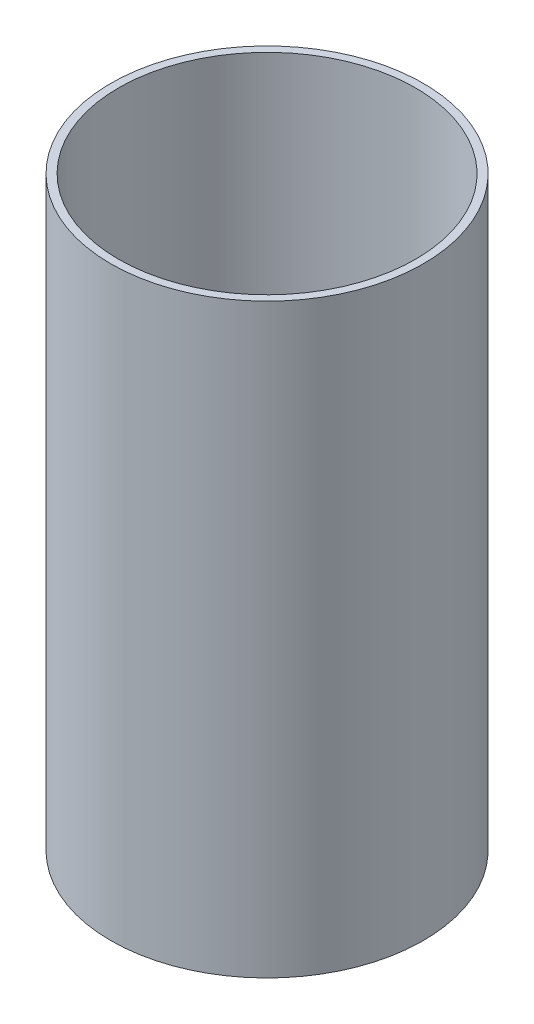
ISO-10303-21;
HEADER;
FILE_DESCRIPTION(('STEP AP214'),'2;1');
FILE_NAME('part.step','',(''),(''),'','','');
FILE_SCHEMA(('AUTOMOTIVE_DESIGN { 1 0 10303 214 1 1 1 1 }'));
ENDSEC;
DATA;
#1=APPLICATION_CONTEXT('core data for automotive mechanical design processes');
#2=APPLICATION_PROTOCOL_DEFINITION('international standard','automotive_design',2000,#1);
#3=PRODUCT_CONTEXT('',#1,'mechanical');
#4=PRODUCT('Part','Part','',(#3));
#5=PRODUCT_RELATED_PRODUCT_CATEGORY('part','',(#4));
#6=PRODUCT_DEFINITION_FORMATION('','',#4);
#7=PRODUCT_DEFINITION_CONTEXT('part definition',#1,'design');
#8=PRODUCT_DEFINITION('design','',#6,#7);
#9=PRODUCT_DEFINITION_SHAPE('','',#8);
#10=(LENGTH_UNIT() NAMED_UNIT(*) SI_UNIT(.MILLI.,.METRE.));
#11=(NAMED_UNIT(*) PLANE_ANGLE_UNIT() SI_UNIT($,.RADIAN.));
#12=(NAMED_UNIT(*) SI_UNIT($,.STERADIAN.) SOLID_ANGLE_UNIT());
#13=UNCERTAINTY_MEASURE_WITH_UNIT(LENGTH_MEASURE(1.E-05),#10,'distance_accuracy_value','');
#14=(GEOMETRIC_REPRESENTATION_CONTEXT(3) GLOBAL_UNCERTAINTY_ASSIGNED_CONTEXT((#13)) GLOBAL_UNIT_ASSIGNED_CONTEXT((#10,
#11,#12)) REPRESENTATION_CONTEXT('',''));
#15=CARTESIAN_POINT('',(0.,0.,0.));
#16=DIRECTION('',(0.,0.,1.));
#17=DIRECTION('',(1.,0.,0.));
#18=AXIS2_PLACEMENT_3D('',#15,#16,#17);
#19=CARTESIAN_POINT('',(0.,150.,0.));
#20=DIRECTION('',(0.,1.,0.));
#21=DIRECTION('',(0.,0.,1.));
#22=AXIS2_PLACEMENT_3D('',#19,#20,#21);
#23=PLANE('',#22);
#24=CARTESIAN_POINT('',(0.,150.,0.));
#25=DIRECTION('',(0.,1.,0.));
#26=DIRECTION('',(0.,0.,1.));
#27=AXIS2_PLACEMENT_3D('',#24,#25,#26);
#28=CIRCLE('',#27,40.);
#29=CARTESIAN_POINT('',(0.,150.,40.));
#30=VERTEX_POINT('',#29);
#31=EDGE_CURVE('E10',#30,#30,#28,.T.);
#32=ORIENTED_EDGE('',*,*,#31,.T.);
#33=EDGE_LOOP('',(#32));
#34=FACE_BOUND('',#33,.T.);
#35=CARTESIAN_POINT('',(0.,150.,0.));
#36=DIRECTION('',(0.,1.,0.));
#37=DIRECTION('',(0.,0.,1.));
#38=AXIS2_PLACEMENT_3D('',#35,#36,#37);
#39=CIRCLE('',#38,38.);
#40=CARTESIAN_POINT('',(0.,150.,38.));
#41=VERTEX_POINT('',#40);
#42=EDGE_CURVE('E50',#41,#41,#39,.T.);
#43=ORIENTED_EDGE('',*,*,#42,.F.);
#44=EDGE_LOOP('',(#43));
#45=FACE_BOUND('',#44,.T.);
#46=ADVANCED_FACE('F37',(#34,#45),#23,.T.);
#47=CARTESIAN_POINT('',(0.,0.,0.));
#48=DIRECTION('',(0.,1.,0.));
#49=DIRECTION('',(0.,0.,1.));
#50=AXIS2_PLACEMENT_3D('',#47,#48,#49);
#51=PLANE('',#50);
#52=CARTESIAN_POINT('',(0.,0.,0.));
#53=DIRECTION('',(0.,1.,0.));
#54=DIRECTION('',(0.,0.,1.));
#55=AXIS2_PLACEMENT_3D('',#52,#53,#54);
#56=CIRCLE('',#55,40.);
#57=CARTESIAN_POINT('',(0.,0.,40.));
#58=VERTEX_POINT('',#57);
#59=EDGE_CURVE('E41',#58,#58,#56,.T.);
#60=ORIENTED_EDGE('',*,*,#59,.F.);
#61=EDGE_LOOP('',(#60));
#62=FACE_BOUND('',#61,.T.);
#63=CARTESIAN_POINT('',(0.,0.,0.));
#64=DIRECTION('',(0.,1.,0.));
#65=DIRECTION('',(0.,0.,1.));
#66=AXIS2_PLACEMENT_3D('',#63,#64,#65);
#67=CIRCLE('',#66,38.);
#68=CARTESIAN_POINT('',(0.,0.,38.));
#69=VERTEX_POINT('',#68);
#70=EDGE_CURVE('E52',#69,#69,#67,.T.);
#71=ORIENTED_EDGE('',*,*,#70,.T.);
#72=EDGE_LOOP('',(#71));
#73=FACE_BOUND('',#72,.T.);
#74=ADVANCED_FACE('F64',(#62,#73),#51,.F.);
#75=CARTESIAN_POINT('',(0.,150.,0.));
#76=DIRECTION('',(0.,-1.,0.));
#77=DIRECTION('',(0.,0.,-1.));
#78=AXIS2_PLACEMENT_3D('',#75,#76,#77);
#79=CYLINDRICAL_SURFACE('',#78,40.);
#80=ORIENTED_EDGE('',*,*,#31,.F.);
#81=EDGE_LOOP('',(#80));
#82=FACE_BOUND('',#81,.T.);
#83=ORIENTED_EDGE('',*,*,#59,.T.);
#84=EDGE_LOOP('',(#83));
#85=FACE_BOUND('',#84,.T.);
#86=ADVANCED_FACE('F39',(#82,#85),#79,.T.);
#87=CARTESIAN_POINT('',(0.,150.,0.));
#88=DIRECTION('',(0.,-1.,0.));
#89=DIRECTION('',(0.,0.,-1.));
#90=AXIS2_PLACEMENT_3D('',#87,#88,#89);
#91=CYLINDRICAL_SURFACE('',#90,38.);
#92=ORIENTED_EDGE('',*,*,#42,.T.);
#93=EDGE_LOOP('',(#92));
#94=FACE_BOUND('',#93,.T.);
#95=ORIENTED_EDGE('',*,*,#70,.F.);
#96=EDGE_LOOP('',(#95));
#97=FACE_BOUND('',#96,.T.);
#98=ADVANCED_FACE('F60',(#94,#97),#91,.F.);
#99=CLOSED_SHELL('',(#46,#74,#86,#98));
#100=MANIFOLD_SOLID_BREP('B2',#99);
#101=ADVANCED_BREP_SHAPE_REPRESENTATION('',(#18,#100),#14);
#102=SHAPE_DEFINITION_REPRESENTATION(#9,#101);
ENDSEC;
END-ISO-10303-21;
